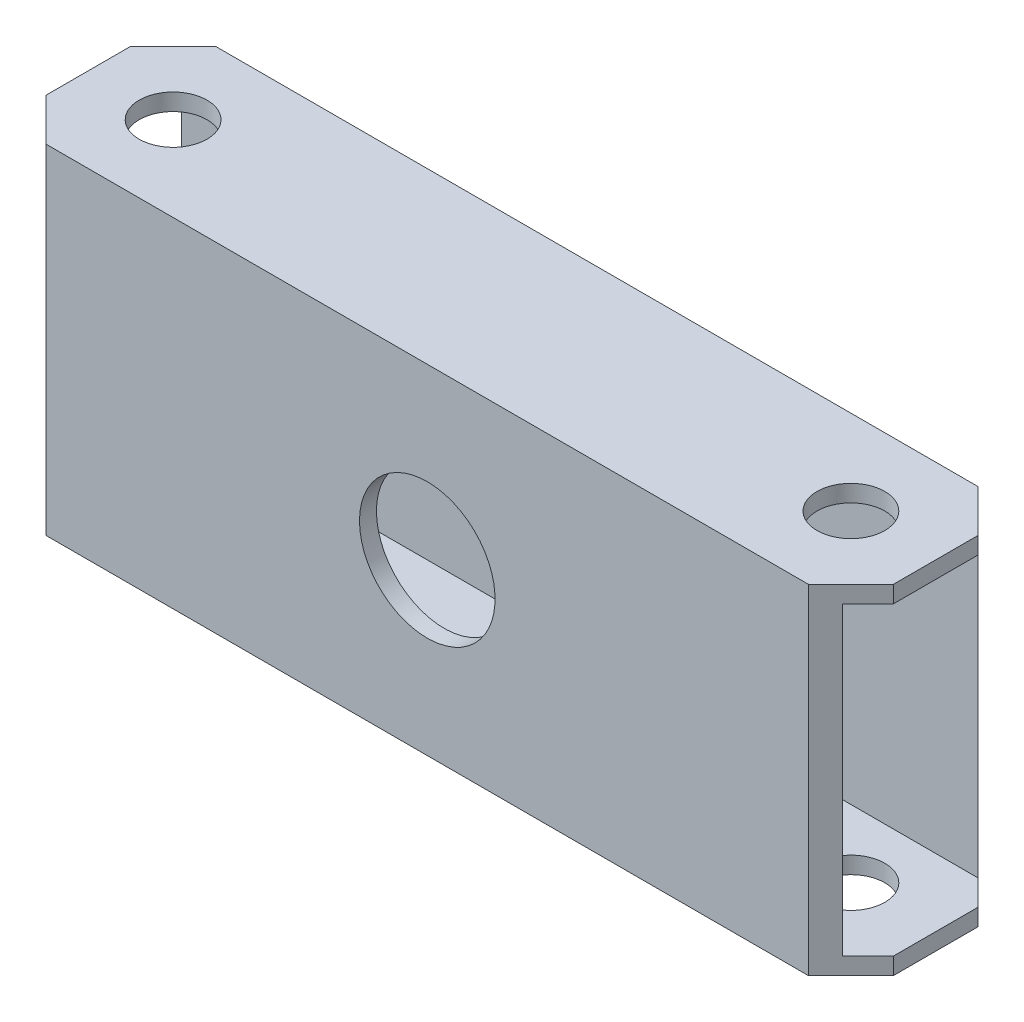
ISO-10303-21;
HEADER;
FILE_DESCRIPTION(('STEP AP214'),'2;1');
FILE_NAME('part.step','',(''),(''),'','','');
FILE_SCHEMA(('AUTOMOTIVE_DESIGN { 1 0 10303 214 1 1 1 1 }'));
ENDSEC;
DATA;
#1=APPLICATION_CONTEXT('core data for automotive mechanical design processes');
#2=APPLICATION_PROTOCOL_DEFINITION('international standard','automotive_design',2000,#1);
#3=PRODUCT_CONTEXT('',#1,'mechanical');
#4=PRODUCT('Part','Part','',(#3));
#5=PRODUCT_RELATED_PRODUCT_CATEGORY('part','',(#4));
#6=PRODUCT_DEFINITION_FORMATION('','',#4);
#7=PRODUCT_DEFINITION_CONTEXT('part definition',#1,'design');
#8=PRODUCT_DEFINITION('design','',#6,#7);
#9=PRODUCT_DEFINITION_SHAPE('','',#8);
#10=(LENGTH_UNIT() NAMED_UNIT(*) SI_UNIT(.MILLI.,.METRE.));
#11=(NAMED_UNIT(*) PLANE_ANGLE_UNIT() SI_UNIT($,.RADIAN.));
#12=(NAMED_UNIT(*) SI_UNIT($,.STERADIAN.) SOLID_ANGLE_UNIT());
#13=UNCERTAINTY_MEASURE_WITH_UNIT(LENGTH_MEASURE(1.E-05),#10,'distance_accuracy_value','');
#14=(GEOMETRIC_REPRESENTATION_CONTEXT(3) GLOBAL_UNCERTAINTY_ASSIGNED_CONTEXT((#13)) GLOBAL_UNIT_ASSIGNED_CONTEXT((#10,
#11,#12)) REPRESENTATION_CONTEXT('',''));
#15=CARTESIAN_POINT('',(0.,0.,0.));
#16=DIRECTION('',(0.,0.,1.));
#17=DIRECTION('',(1.,0.,0.));
#18=AXIS2_PLACEMENT_3D('',#15,#16,#17);
#19=CARTESIAN_POINT('',(0.,40.,0.));
#20=DIRECTION('',(1.,0.,0.));
#21=DIRECTION('',(0.,0.,-1.));
#22=AXIS2_PLACEMENT_3D('',#19,#20,#21);
#23=PLANE('',#22);
#24=DIRECTION('',(0.,0.,1.));
#25=VECTOR('',#24,1.);
#26=CARTESIAN_POINT('',(0.,40.,0.));
#27=LINE('',#26,#25);
#28=CARTESIAN_POINT('',(0.,40.,-14.9999999999999));
#29=VERTEX_POINT('',#28);
#30=CARTESIAN_POINT('',(0.,40.,-5.00000000000004));
#31=VERTEX_POINT('',#30);
#32=EDGE_CURVE('E309',#29,#31,#27,.T.);
#33=ORIENTED_EDGE('',*,*,#32,.F.);
#34=DIRECTION('',(0.,-1.,0.));
#35=VECTOR('',#34,1.);
#36=CARTESIAN_POINT('',(0.,40.,-14.9999999999999));
#37=LINE('',#36,#35);
#38=CARTESIAN_POINT('',(0.,38.,-14.9999999999999));
#39=VERTEX_POINT('',#38);
#40=EDGE_CURVE('E14',#29,#39,#37,.T.);
#41=ORIENTED_EDGE('',*,*,#40,.T.);
#42=DIRECTION('',(0.,0.,1.));
#43=VECTOR('',#42,1.);
#44=CARTESIAN_POINT('',(0.,38.,-18.));
#45=LINE('',#44,#43);
#46=CARTESIAN_POINT('',(0.,38.,-5.00000000000004));
#47=VERTEX_POINT('',#46);
#48=EDGE_CURVE('E369',#39,#47,#45,.T.);
#49=ORIENTED_EDGE('',*,*,#48,.T.);
#50=DIRECTION('',(0.,1.,0.));
#51=VECTOR('',#50,1.);
#52=CARTESIAN_POINT('',(0.,40.,-5.00000000000004));
#53=LINE('',#52,#51);
#54=EDGE_CURVE('E463',#47,#31,#53,.T.);
#55=ORIENTED_EDGE('',*,*,#54,.T.);
#56=EDGE_LOOP('',(#33,#41,#49,#55));
#57=FACE_BOUND('',#56,.T.);
#58=ADVANCED_FACE('F159',(#57),#23,.F.);
#59=CARTESIAN_POINT('',(100.,40.,0.));
#60=DIRECTION('',(-1.,0.,0.));
#61=DIRECTION('',(0.,0.,1.));
#62=AXIS2_PLACEMENT_3D('',#59,#60,#61);
#63=PLANE('',#62);
#64=DIRECTION('',(0.,0.,-1.));
#65=VECTOR('',#64,1.);
#66=CARTESIAN_POINT('',(100.,0.,0.));
#67=LINE('',#66,#65);
#68=CARTESIAN_POINT('',(100.,0.,-5.00000000000009));
#69=VERTEX_POINT('',#68);
#70=CARTESIAN_POINT('',(100.,0.,-15.));
#71=VERTEX_POINT('',#70);
#72=EDGE_CURVE('E310',#69,#71,#67,.T.);
#73=ORIENTED_EDGE('',*,*,#72,.T.);
#74=DIRECTION('',(0.,1.,0.));
#75=VECTOR('',#74,1.);
#76=CARTESIAN_POINT('',(100.,40.,-15.));
#77=LINE('',#76,#75);
#78=CARTESIAN_POINT('',(100.,2.,-15.));
#79=VERTEX_POINT('',#78);
#80=EDGE_CURVE('E282',#71,#79,#77,.T.);
#81=ORIENTED_EDGE('',*,*,#80,.T.);
#82=DIRECTION('',(0.,0.,-1.));
#83=VECTOR('',#82,1.);
#84=CARTESIAN_POINT('',(100.,2.,-2.));
#85=LINE('',#84,#83);
#86=CARTESIAN_POINT('',(100.,2.,-5.00000000000009));
#87=VERTEX_POINT('',#86);
#88=EDGE_CURVE('E347',#87,#79,#85,.T.);
#89=ORIENTED_EDGE('',*,*,#88,.F.);
#90=DIRECTION('',(0.,-1.,0.));
#91=VECTOR('',#90,1.);
#92=CARTESIAN_POINT('',(100.,40.,-5.00000000000009));
#93=LINE('',#92,#91);
#94=EDGE_CURVE('E288',#87,#69,#93,.T.);
#95=ORIENTED_EDGE('',*,*,#94,.T.);
#96=EDGE_LOOP('',(#73,#81,#89,#95));
#97=FACE_BOUND('',#96,.T.);
#98=ADVANCED_FACE('F516',(#97),#63,.F.);
#99=DIRECTION('',(0.,0.,-1.));
#100=VECTOR('',#99,1.);
#101=CARTESIAN_POINT('',(0.,2.,-2.));
#102=LINE('',#101,#100);
#103=CARTESIAN_POINT('',(0.,2.,-5.00000000000004));
#104=VERTEX_POINT('',#103);
#105=CARTESIAN_POINT('',(0.,2.,-14.9999999999999));
#106=VERTEX_POINT('',#105);
#107=EDGE_CURVE('E398',#104,#106,#102,.T.);
#108=ORIENTED_EDGE('',*,*,#107,.T.);
#109=DIRECTION('',(0.,-1.,0.));
#110=VECTOR('',#109,1.);
#111=CARTESIAN_POINT('',(0.,40.,-14.9999999999999));
#112=LINE('',#111,#110);
#113=CARTESIAN_POINT('',(0.,0.,-14.9999999999999));
#114=VERTEX_POINT('',#113);
#115=EDGE_CURVE('E169',#106,#114,#112,.T.);
#116=ORIENTED_EDGE('',*,*,#115,.T.);
#117=DIRECTION('',(0.,0.,1.));
#118=VECTOR('',#117,1.);
#119=CARTESIAN_POINT('',(0.,0.,0.));
#120=LINE('',#119,#118);
#121=CARTESIAN_POINT('',(0.,0.,-5.00000000000004));
#122=VERTEX_POINT('',#121);
#123=EDGE_CURVE('E474',#114,#122,#120,.T.);
#124=ORIENTED_EDGE('',*,*,#123,.T.);
#125=DIRECTION('',(0.,1.,0.));
#126=VECTOR('',#125,1.);
#127=CARTESIAN_POINT('',(0.,40.,-5.00000000000004));
#128=LINE('',#127,#126);
#129=EDGE_CURVE('E466',#122,#104,#128,.T.);
#130=ORIENTED_EDGE('',*,*,#129,.T.);
#131=EDGE_LOOP('',(#108,#116,#124,#130));
#132=FACE_BOUND('',#131,.T.);
#133=ADVANCED_FACE('F473',(#132),#23,.F.);
#134=DIRECTION('',(0.,0.,1.));
#135=VECTOR('',#134,1.);
#136=CARTESIAN_POINT('',(100.,38.,-18.));
#137=LINE('',#136,#135);
#138=CARTESIAN_POINT('',(100.,38.,-15.));
#139=VERTEX_POINT('',#138);
#140=CARTESIAN_POINT('',(100.,38.,-5.00000000000009));
#141=VERTEX_POINT('',#140);
#142=EDGE_CURVE('E325',#139,#141,#137,.T.);
#143=ORIENTED_EDGE('',*,*,#142,.F.);
#144=DIRECTION('',(0.,1.,0.));
#145=VECTOR('',#144,1.);
#146=CARTESIAN_POINT('',(100.,40.,-15.));
#147=LINE('',#146,#145);
#148=CARTESIAN_POINT('',(100.,40.,-15.));
#149=VERTEX_POINT('',#148);
#150=EDGE_CURVE('E428',#139,#149,#147,.T.);
#151=ORIENTED_EDGE('',*,*,#150,.T.);
#152=DIRECTION('',(0.,0.,-1.));
#153=VECTOR('',#152,1.);
#154=CARTESIAN_POINT('',(100.,40.,0.));
#155=LINE('',#154,#153);
#156=CARTESIAN_POINT('',(100.,40.,-5.00000000000009));
#157=VERTEX_POINT('',#156);
#158=EDGE_CURVE('E490',#157,#149,#155,.T.);
#159=ORIENTED_EDGE('',*,*,#158,.F.);
#160=DIRECTION('',(0.,-1.,0.));
#161=VECTOR('',#160,1.);
#162=CARTESIAN_POINT('',(100.,40.,-5.00000000000009));
#163=LINE('',#162,#161);
#164=EDGE_CURVE('E505',#157,#141,#163,.T.);
#165=ORIENTED_EDGE('',*,*,#164,.T.);
#166=EDGE_LOOP('',(#143,#151,#159,#165));
#167=FACE_BOUND('',#166,.T.);
#168=ADVANCED_FACE('F508',(#167),#63,.F.);
#169=CARTESIAN_POINT('',(90.,0.,-10.));
#170=DIRECTION('',(0.,1.,0.));
#171=DIRECTION('',(0.,0.,1.));
#172=AXIS2_PLACEMENT_3D('',#169,#170,#171);
#173=CYLINDRICAL_SURFACE('',#172,4.00000000000001);
#174=CARTESIAN_POINT('',(90.,0.,-10.));
#175=DIRECTION('',(0.,1.,0.));
#176=DIRECTION('',(0.,0.,1.));
#177=AXIS2_PLACEMENT_3D('',#174,#175,#176);
#178=CIRCLE('',#177,4.00000000000001);
#179=CARTESIAN_POINT('',(90.,0.,-6.));
#180=VERTEX_POINT('',#179);
#181=EDGE_CURVE('E550',#180,#180,#178,.F.);
#182=ORIENTED_EDGE('',*,*,#181,.T.);
#183=EDGE_LOOP('',(#182));
#184=FACE_BOUND('',#183,.T.);
#185=CARTESIAN_POINT('',(90.,2.,-10.));
#186=DIRECTION('',(0.,1.,0.));
#187=DIRECTION('',(0.,0.,1.));
#188=AXIS2_PLACEMENT_3D('',#185,#186,#187);
#189=CIRCLE('',#188,4.00000000000001);
#190=CARTESIAN_POINT('',(90.,2.,-6.));
#191=VERTEX_POINT('',#190);
#192=EDGE_CURVE('E338',#191,#191,#189,.T.);
#193=ORIENTED_EDGE('',*,*,#192,.T.);
#194=EDGE_LOOP('',(#193));
#195=FACE_BOUND('',#194,.T.);
#196=ADVANCED_FACE('F596',(#184,#195),#173,.F.);
#197=CARTESIAN_POINT('',(90.,40.,-10.));
#198=DIRECTION('',(0.,1.,0.));
#199=DIRECTION('',(0.,0.,1.));
#200=AXIS2_PLACEMENT_3D('',#197,#198,#199);
#201=CIRCLE('',#200,4.00000000000001);
#202=CARTESIAN_POINT('',(90.,40.,-6.));
#203=VERTEX_POINT('',#202);
#204=EDGE_CURVE('E546',#203,#203,#201,.F.);
#205=ORIENTED_EDGE('',*,*,#204,.F.);
#206=EDGE_LOOP('',(#205));
#207=FACE_BOUND('',#206,.T.);
#208=CARTESIAN_POINT('',(90.,38.,-10.));
#209=DIRECTION('',(0.,-1.,0.));
#210=DIRECTION('',(0.,0.,-1.));
#211=AXIS2_PLACEMENT_3D('',#208,#209,#210);
#212=CIRCLE('',#211,4.00000000000001);
#213=CARTESIAN_POINT('',(90.,38.,-14.));
#214=VERTEX_POINT('',#213);
#215=EDGE_CURVE('E333',#214,#214,#212,.T.);
#216=ORIENTED_EDGE('',*,*,#215,.T.);
#217=EDGE_LOOP('',(#216));
#218=FACE_BOUND('',#217,.T.);
#219=ADVANCED_FACE('F568',(#207,#218),#173,.F.);
#220=CARTESIAN_POINT('',(10.,0.,-10.));
#221=DIRECTION('',(0.,1.,0.));
#222=DIRECTION('',(0.,0.,1.));
#223=AXIS2_PLACEMENT_3D('',#220,#221,#222);
#224=CYLINDRICAL_SURFACE('',#223,4.);
#225=CARTESIAN_POINT('',(10.,0.,-10.));
#226=DIRECTION('',(0.,1.,0.));
#227=DIRECTION('',(0.,0.,1.));
#228=AXIS2_PLACEMENT_3D('',#225,#226,#227);
#229=CIRCLE('',#228,4.);
#230=CARTESIAN_POINT('',(10.,0.,-6.));
#231=VERTEX_POINT('',#230);
#232=EDGE_CURVE('E480',#231,#231,#229,.T.);
#233=ORIENTED_EDGE('',*,*,#232,.F.);
#234=EDGE_LOOP('',(#233));
#235=FACE_BOUND('',#234,.T.);
#236=CARTESIAN_POINT('',(10.,2.,-10.));
#237=DIRECTION('',(0.,1.,0.));
#238=DIRECTION('',(0.,0.,1.));
#239=AXIS2_PLACEMENT_3D('',#236,#237,#238);
#240=CIRCLE('',#239,4.);
#241=CARTESIAN_POINT('',(10.,2.,-6.));
#242=VERTEX_POINT('',#241);
#243=EDGE_CURVE('E334',#242,#242,#240,.F.);
#244=ORIENTED_EDGE('',*,*,#243,.F.);
#245=EDGE_LOOP('',(#244));
#246=FACE_BOUND('',#245,.T.);
#247=ADVANCED_FACE('F564',(#235,#246),#224,.F.);
#248=CARTESIAN_POINT('',(10.,40.,-10.));
#249=DIRECTION('',(0.,1.,0.));
#250=DIRECTION('',(0.,0.,1.));
#251=AXIS2_PLACEMENT_3D('',#248,#249,#250);
#252=CIRCLE('',#251,4.);
#253=CARTESIAN_POINT('',(10.,40.,-6.));
#254=VERTEX_POINT('',#253);
#255=EDGE_CURVE('E554',#254,#254,#252,.T.);
#256=ORIENTED_EDGE('',*,*,#255,.T.);
#257=EDGE_LOOP('',(#256));
#258=FACE_BOUND('',#257,.T.);
#259=CARTESIAN_POINT('',(10.,38.,-10.));
#260=DIRECTION('',(0.,-1.,0.));
#261=DIRECTION('',(0.,0.,-1.));
#262=AXIS2_PLACEMENT_3D('',#259,#260,#261);
#263=CIRCLE('',#262,4.);
#264=CARTESIAN_POINT('',(10.,38.,-14.));
#265=VERTEX_POINT('',#264);
#266=EDGE_CURVE('E329',#265,#265,#263,.F.);
#267=ORIENTED_EDGE('',*,*,#266,.F.);
#268=EDGE_LOOP('',(#267));
#269=FACE_BOUND('',#268,.T.);
#270=ADVANCED_FACE('F567',(#258,#269),#224,.F.);
#271=CARTESIAN_POINT('',(50.,20.,0.));
#272=DIRECTION('',(0.,0.,-1.));
#273=DIRECTION('',(-1.,0.,0.));
#274=AXIS2_PLACEMENT_3D('',#271,#272,#273);
#275=CYLINDRICAL_SURFACE('',#274,8.);
#276=CARTESIAN_POINT('',(50.,20.,0.));
#277=DIRECTION('',(0.,0.,-1.));
#278=DIRECTION('',(-1.,0.,0.));
#279=AXIS2_PLACEMENT_3D('',#276,#277,#278);
#280=CIRCLE('',#279,8.);
#281=CARTESIAN_POINT('',(42.,20.,0.));
#282=VERTEX_POINT('',#281);
#283=EDGE_CURVE('E542',#282,#282,#280,.T.);
#284=ORIENTED_EDGE('',*,*,#283,.F.);
#285=EDGE_LOOP('',(#284));
#286=FACE_BOUND('',#285,.T.);
#287=CARTESIAN_POINT('',(50.,20.,-2.));
#288=DIRECTION('',(0.,0.,-1.));
#289=DIRECTION('',(0.,1.,0.));
#290=AXIS2_PLACEMENT_3D('',#287,#288,#289);
#291=CIRCLE('',#290,8.);
#292=CARTESIAN_POINT('',(50.,28.,-2.));
#293=VERTEX_POINT('',#292);
#294=EDGE_CURVE('E324',#293,#293,#291,.F.);
#295=ORIENTED_EDGE('',*,*,#294,.F.);
#296=EDGE_LOOP('',(#295));
#297=FACE_BOUND('',#296,.T.);
#298=ADVANCED_FACE('F643',(#286,#297),#275,.F.);
#299=CARTESIAN_POINT('',(50.,20.,-20.));
#300=DIRECTION('',(0.,0.,-1.));
#301=DIRECTION('',(-1.,0.,0.));
#302=AXIS2_PLACEMENT_3D('',#299,#300,#301);
#303=CIRCLE('',#302,8.);
#304=CARTESIAN_POINT('',(42.,20.,-20.));
#305=VERTEX_POINT('',#304);
#306=EDGE_CURVE('E539',#305,#305,#303,.T.);
#307=ORIENTED_EDGE('',*,*,#306,.T.);
#308=EDGE_LOOP('',(#307));
#309=FACE_BOUND('',#308,.T.);
#310=CARTESIAN_POINT('',(50.,20.,-18.));
#311=DIRECTION('',(0.,0.,1.));
#312=DIRECTION('',(0.,-1.,0.));
#313=AXIS2_PLACEMENT_3D('',#310,#311,#312);
#314=CIRCLE('',#313,8.);
#315=CARTESIAN_POINT('',(50.,12.,-18.));
#316=VERTEX_POINT('',#315);
#317=EDGE_CURVE('E320',#316,#316,#314,.F.);
#318=ORIENTED_EDGE('',*,*,#317,.F.);
#319=EDGE_LOOP('',(#318));
#320=FACE_BOUND('',#319,.T.);
#321=ADVANCED_FACE('F646',(#309,#320),#275,.F.);
#322=CARTESIAN_POINT('',(0.,40.,0.));
#323=DIRECTION('',(0.,-1.,0.));
#324=DIRECTION('',(0.,0.,-1.));
#325=AXIS2_PLACEMENT_3D('',#322,#323,#324);
#326=PLANE('',#325);
#327=ORIENTED_EDGE('',*,*,#158,.T.);
#328=DIRECTION('',(0.707106781186551,0.,0.707106781186544));
#329=VECTOR('',#328,1.);
#330=CARTESIAN_POINT('',(94.9999999999999,40.,-20.));
#331=LINE('',#330,#329);
#332=CARTESIAN_POINT('',(94.9999999999999,40.,-20.));
#333=VERTEX_POINT('',#332);
#334=EDGE_CURVE('E448',#149,#333,#331,.F.);
#335=ORIENTED_EDGE('',*,*,#334,.T.);
#336=DIRECTION('',(-1.,0.,0.));
#337=VECTOR('',#336,1.);
#338=CARTESIAN_POINT('',(0.,40.,-20.));
#339=LINE('',#338,#337);
#340=CARTESIAN_POINT('',(5.00000000000004,40.,-20.));
#341=VERTEX_POINT('',#340);
#342=EDGE_CURVE('E298',#333,#341,#339,.T.);
#343=ORIENTED_EDGE('',*,*,#342,.T.);
#344=DIRECTION('',(0.707106781186544,0.,-0.707106781186551));
#345=VECTOR('',#344,1.);
#346=CARTESIAN_POINT('',(0.,40.,-14.9999999999999));
#347=LINE('',#346,#345);
#348=EDGE_CURVE('E437',#341,#29,#347,.F.);
#349=ORIENTED_EDGE('',*,*,#348,.T.);
#350=ORIENTED_EDGE('',*,*,#32,.T.);
#351=DIRECTION('',(-0.707106781186551,0.,-0.707106781186544));
#352=VECTOR('',#351,1.);
#353=CARTESIAN_POINT('',(5.00000000000009,40.,0.));
#354=LINE('',#353,#352);
#355=CARTESIAN_POINT('',(5.00000000000009,40.,0.));
#356=VERTEX_POINT('',#355);
#357=EDGE_CURVE('E183',#31,#356,#354,.F.);
#358=ORIENTED_EDGE('',*,*,#357,.T.);
#359=DIRECTION('',(1.,0.,0.));
#360=VECTOR('',#359,1.);
#361=CARTESIAN_POINT('',(0.,40.,0.));
#362=LINE('',#361,#360);
#363=CARTESIAN_POINT('',(95.,40.,0.));
#364=VERTEX_POINT('',#363);
#365=EDGE_CURVE('E314',#356,#364,#362,.T.);
#366=ORIENTED_EDGE('',*,*,#365,.T.);
#367=DIRECTION('',(-0.707106781186544,0.,0.707106781186551));
#368=VECTOR('',#367,1.);
#369=CARTESIAN_POINT('',(100.,40.,-5.00000000000009));
#370=LINE('',#369,#368);
#371=EDGE_CURVE('E445',#364,#157,#370,.F.);
#372=ORIENTED_EDGE('',*,*,#371,.T.);
#373=EDGE_LOOP('',(#327,#335,#343,#349,#350,#358,#366,#372));
#374=FACE_BOUND('',#373,.T.);
#375=ORIENTED_EDGE('',*,*,#204,.T.);
#376=EDGE_LOOP('',(#375));
#377=FACE_BOUND('',#376,.T.);
#378=ORIENTED_EDGE('',*,*,#255,.F.);
#379=EDGE_LOOP('',(#378));
#380=FACE_BOUND('',#379,.T.);
#381=ADVANCED_FACE('F486',(#374,#377,#380),#326,.F.);
#382=CARTESIAN_POINT('',(0.,0.,0.));
#383=DIRECTION('',(0.,-1.,0.));
#384=DIRECTION('',(0.,0.,-1.));
#385=AXIS2_PLACEMENT_3D('',#382,#383,#384);
#386=PLANE('',#385);
#387=ORIENTED_EDGE('',*,*,#181,.F.);
#388=EDGE_LOOP('',(#387));
#389=FACE_BOUND('',#388,.T.);
#390=DIRECTION('',(-1.,0.,0.));
#391=VECTOR('',#390,1.);
#392=CARTESIAN_POINT('',(0.,0.,-20.));
#393=LINE('',#392,#391);
#394=CARTESIAN_POINT('',(94.9999999999999,0.,-20.));
#395=VERTEX_POINT('',#394);
#396=CARTESIAN_POINT('',(5.00000000000004,0.,-20.));
#397=VERTEX_POINT('',#396);
#398=EDGE_CURVE('E295',#395,#397,#393,.T.);
#399=ORIENTED_EDGE('',*,*,#398,.F.);
#400=DIRECTION('',(-0.707106781186551,0.,-0.707106781186544));
#401=VECTOR('',#400,1.);
#402=CARTESIAN_POINT('',(57.4999999999995,0.,-57.5000000000001));
#403=LINE('',#402,#401);
#404=EDGE_CURVE('E276',#395,#71,#403,.F.);
#405=ORIENTED_EDGE('',*,*,#404,.T.);
#406=ORIENTED_EDGE('',*,*,#72,.F.);
#407=DIRECTION('',(0.707106781186544,0.,-0.707106781186551));
#408=VECTOR('',#407,1.);
#409=CARTESIAN_POINT('',(47.5000000000005,0.,47.5));
#410=LINE('',#409,#408);
#411=CARTESIAN_POINT('',(95.,0.,0.));
#412=VERTEX_POINT('',#411);
#413=EDGE_CURVE('E289',#69,#412,#410,.F.);
#414=ORIENTED_EDGE('',*,*,#413,.T.);
#415=DIRECTION('',(1.,0.,0.));
#416=VECTOR('',#415,1.);
#417=CARTESIAN_POINT('',(0.,0.,0.));
#418=LINE('',#417,#416);
#419=CARTESIAN_POINT('',(5.00000000000009,0.,0.));
#420=VERTEX_POINT('',#419);
#421=EDGE_CURVE('E316',#420,#412,#418,.T.);
#422=ORIENTED_EDGE('',*,*,#421,.F.);
#423=DIRECTION('',(0.707106781186551,0.,0.707106781186544));
#424=VECTOR('',#423,1.);
#425=CARTESIAN_POINT('',(2.50000000000002,0.,-2.50000000000004));
#426=LINE('',#425,#424);
#427=EDGE_CURVE('E300',#420,#122,#426,.F.);
#428=ORIENTED_EDGE('',*,*,#427,.T.);
#429=ORIENTED_EDGE('',*,*,#123,.F.);
#430=DIRECTION('',(-0.707106781186544,0.,0.707106781186551));
#431=VECTOR('',#430,1.);
#432=CARTESIAN_POINT('',(-7.49999999999996,0.,-7.49999999999988));
#433=LINE('',#432,#431);
#434=EDGE_CURVE('E307',#114,#397,#433,.F.);
#435=ORIENTED_EDGE('',*,*,#434,.T.);
#436=EDGE_LOOP('',(#399,#405,#406,#414,#422,#428,#429,#435));
#437=FACE_BOUND('',#436,.T.);
#438=ORIENTED_EDGE('',*,*,#232,.T.);
#439=EDGE_LOOP('',(#438));
#440=FACE_BOUND('',#439,.T.);
#441=ADVANCED_FACE('F303',(#389,#437,#440),#386,.T.);
#442=CARTESIAN_POINT('',(0.,40.,0.));
#443=DIRECTION('',(0.,0.,-1.));
#444=DIRECTION('',(-1.,0.,0.));
#445=AXIS2_PLACEMENT_3D('',#442,#443,#444);
#446=PLANE('',#445);
#447=ORIENTED_EDGE('',*,*,#283,.T.);
#448=EDGE_LOOP('',(#447));
#449=FACE_BOUND('',#448,.T.);
#450=ORIENTED_EDGE('',*,*,#421,.T.);
#451=DIRECTION('',(0.,1.,0.));
#452=VECTOR('',#451,1.);
#453=CARTESIAN_POINT('',(95.,40.,0.));
#454=LINE('',#453,#452);
#455=EDGE_CURVE('E176',#412,#364,#454,.T.);
#456=ORIENTED_EDGE('',*,*,#455,.T.);
#457=ORIENTED_EDGE('',*,*,#365,.F.);
#458=DIRECTION('',(0.,-1.,0.));
#459=VECTOR('',#458,1.);
#460=CARTESIAN_POINT('',(5.00000000000009,40.,0.));
#461=LINE('',#460,#459);
#462=EDGE_CURVE('E457',#356,#420,#461,.T.);
#463=ORIENTED_EDGE('',*,*,#462,.T.);
#464=EDGE_LOOP('',(#450,#456,#457,#463));
#465=FACE_BOUND('',#464,.T.);
#466=ADVANCED_FACE('F496',(#449,#465),#446,.F.);
#467=CARTESIAN_POINT('',(0.,40.,-20.));
#468=DIRECTION('',(0.,0.,1.));
#469=DIRECTION('',(1.,0.,0.));
#470=AXIS2_PLACEMENT_3D('',#467,#468,#469);
#471=PLANE('',#470);
#472=ORIENTED_EDGE('',*,*,#306,.F.);
#473=EDGE_LOOP('',(#472));
#474=FACE_BOUND('',#473,.T.);
#475=ORIENTED_EDGE('',*,*,#342,.F.);
#476=DIRECTION('',(0.,-1.,0.));
#477=VECTOR('',#476,1.);
#478=CARTESIAN_POINT('',(94.9999999999999,40.,-20.));
#479=LINE('',#478,#477);
#480=EDGE_CURVE('E281',#333,#395,#479,.T.);
#481=ORIENTED_EDGE('',*,*,#480,.T.);
#482=ORIENTED_EDGE('',*,*,#398,.T.);
#483=DIRECTION('',(0.,1.,0.));
#484=VECTOR('',#483,1.);
#485=CARTESIAN_POINT('',(5.00000000000004,40.,-20.));
#486=LINE('',#485,#484);
#487=EDGE_CURVE('E301',#397,#341,#486,.T.);
#488=ORIENTED_EDGE('',*,*,#487,.T.);
#489=EDGE_LOOP('',(#475,#481,#482,#488));
#490=FACE_BOUND('',#489,.T.);
#491=ADVANCED_FACE('F294',(#474,#490),#471,.F.);
#492=CARTESIAN_POINT('',(100.,2.,-2.));
#493=DIRECTION('',(0.,1.,0.));
#494=DIRECTION('',(0.,0.,1.));
#495=AXIS2_PLACEMENT_3D('',#492,#493,#494);
#496=PLANE('',#495);
#497=ORIENTED_EDGE('',*,*,#192,.F.);
#498=EDGE_LOOP('',(#497));
#499=FACE_BOUND('',#498,.T.);
#500=ORIENTED_EDGE('',*,*,#88,.T.);
#501=DIRECTION('',(0.707106781186551,0.,0.707106781186544));
#502=VECTOR('',#501,1.);
#503=CARTESIAN_POINT('',(106.5,2.,-8.50000000000005));
#504=LINE('',#503,#502);
#505=CARTESIAN_POINT('',(96.9999999999999,2.,-18.));
#506=VERTEX_POINT('',#505);
#507=EDGE_CURVE('E370',#79,#506,#504,.F.);
#508=ORIENTED_EDGE('',*,*,#507,.T.);
#509=DIRECTION('',(-1.,0.,0.));
#510=VECTOR('',#509,1.);
#511=CARTESIAN_POINT('',(100.,2.,-18.));
#512=LINE('',#511,#510);
#513=CARTESIAN_POINT('',(3.00000000000006,2.,-18.));
#514=VERTEX_POINT('',#513);
#515=EDGE_CURVE('E352',#506,#514,#512,.T.);
#516=ORIENTED_EDGE('',*,*,#515,.T.);
#517=DIRECTION('',(0.707106781186544,0.,-0.707106781186551));
#518=VECTOR('',#517,1.);
#519=CARTESIAN_POINT('',(43.4999999999995,2.,-58.4999999999999));
#520=LINE('',#519,#518);
#521=EDGE_CURVE('E406',#514,#106,#520,.F.);
#522=ORIENTED_EDGE('',*,*,#521,.T.);
#523=ORIENTED_EDGE('',*,*,#107,.F.);
#524=DIRECTION('',(-0.707106781186551,0.,-0.707106781186544));
#525=VECTOR('',#524,1.);
#526=CARTESIAN_POINT('',(51.5000000000005,2.,46.5));
#527=LINE('',#526,#525);
#528=CARTESIAN_POINT('',(3.00000000000007,2.,-2.));
#529=VERTEX_POINT('',#528);
#530=EDGE_CURVE('E403',#104,#529,#527,.F.);
#531=ORIENTED_EDGE('',*,*,#530,.T.);
#532=DIRECTION('',(-1.,0.,0.));
#533=VECTOR('',#532,1.);
#534=CARTESIAN_POINT('',(100.,2.,-2.));
#535=LINE('',#534,#533);
#536=CARTESIAN_POINT('',(96.9999999999999,2.,-2.));
#537=VERTEX_POINT('',#536);
#538=EDGE_CURVE('E353',#537,#529,#535,.T.);
#539=ORIENTED_EDGE('',*,*,#538,.F.);
#540=DIRECTION('',(-0.707106781186544,0.,0.707106781186551));
#541=VECTOR('',#540,1.);
#542=CARTESIAN_POINT('',(98.5,2.,-3.50000000000003));
#543=LINE('',#542,#541);
#544=EDGE_CURVE('E408',#537,#87,#543,.F.);
#545=ORIENTED_EDGE('',*,*,#544,.T.);
#546=EDGE_LOOP('',(#500,#508,#516,#522,#523,#531,#539,#545));
#547=FACE_BOUND('',#546,.T.);
#548=ORIENTED_EDGE('',*,*,#243,.T.);
#549=EDGE_LOOP('',(#548));
#550=FACE_BOUND('',#549,.T.);
#551=ADVANCED_FACE('F416',(#499,#547,#550),#496,.T.);
#552=CARTESIAN_POINT('',(100.,38.,-18.));
#553=DIRECTION('',(0.,-1.,0.));
#554=DIRECTION('',(0.,0.,-1.));
#555=AXIS2_PLACEMENT_3D('',#552,#553,#554);
#556=PLANE('',#555);
#557=ORIENTED_EDGE('',*,*,#215,.F.);
#558=EDGE_LOOP('',(#557));
#559=FACE_BOUND('',#558,.T.);
#560=DIRECTION('',(-1.,0.,0.));
#561=VECTOR('',#560,1.);
#562=CARTESIAN_POINT('',(100.,38.,-18.));
#563=LINE('',#562,#561);
#564=CARTESIAN_POINT('',(96.9999999999999,38.,-18.));
#565=VERTEX_POINT('',#564);
#566=CARTESIAN_POINT('',(3.00000000000007,38.,-18.));
#567=VERTEX_POINT('',#566);
#568=EDGE_CURVE('E364',#565,#567,#563,.T.);
#569=ORIENTED_EDGE('',*,*,#568,.F.);
#570=DIRECTION('',(-0.707106781186551,0.,-0.707106781186544));
#571=VECTOR('',#570,1.);
#572=CARTESIAN_POINT('',(98.5,38.,-16.5));
#573=LINE('',#572,#571);
#574=EDGE_CURVE('E427',#565,#139,#573,.F.);
#575=ORIENTED_EDGE('',*,*,#574,.T.);
#576=ORIENTED_EDGE('',*,*,#142,.T.);
#577=DIRECTION('',(0.707106781186544,0.,-0.707106781186551));
#578=VECTOR('',#577,1.);
#579=CARTESIAN_POINT('',(106.5,38.,-11.5000000000001));
#580=LINE('',#579,#578);
#581=CARTESIAN_POINT('',(96.9999999999999,38.,-2.));
#582=VERTEX_POINT('',#581);
#583=EDGE_CURVE('E433',#141,#582,#580,.F.);
#584=ORIENTED_EDGE('',*,*,#583,.T.);
#585=DIRECTION('',(-1.,0.,0.));
#586=VECTOR('',#585,1.);
#587=CARTESIAN_POINT('',(100.,38.,-2.));
#588=LINE('',#587,#586);
#589=CARTESIAN_POINT('',(3.00000000000007,38.,-2.));
#590=VERTEX_POINT('',#589);
#591=EDGE_CURVE('E383',#582,#590,#588,.T.);
#592=ORIENTED_EDGE('',*,*,#591,.T.);
#593=DIRECTION('',(0.707106781186551,0.,0.707106781186544));
#594=VECTOR('',#593,1.);
#595=CARTESIAN_POINT('',(43.5000000000005,38.,38.5));
#596=LINE('',#595,#594);
#597=EDGE_CURVE('E378',#590,#47,#596,.F.);
#598=ORIENTED_EDGE('',*,*,#597,.T.);
#599=ORIENTED_EDGE('',*,*,#48,.F.);
#600=DIRECTION('',(-0.707106781186544,0.,0.707106781186551));
#601=VECTOR('',#600,1.);
#602=CARTESIAN_POINT('',(51.4999999999995,38.,-66.5));
#603=LINE('',#602,#601);
#604=EDGE_CURVE('E439',#39,#567,#603,.F.);
#605=ORIENTED_EDGE('',*,*,#604,.T.);
#606=EDGE_LOOP('',(#569,#575,#576,#584,#592,#598,#599,#605));
#607=FACE_BOUND('',#606,.T.);
#608=ORIENTED_EDGE('',*,*,#266,.T.);
#609=EDGE_LOOP('',(#608));
#610=FACE_BOUND('',#609,.T.);
#611=ADVANCED_FACE('F528',(#559,#607,#610),#556,.T.);
#612=CARTESIAN_POINT('',(100.,38.,-2.));
#613=DIRECTION('',(0.,0.,-1.));
#614=DIRECTION('',(0.,1.,0.));
#615=AXIS2_PLACEMENT_3D('',#612,#613,#614);
#616=PLANE('',#615);
#617=ORIENTED_EDGE('',*,*,#591,.F.);
#618=DIRECTION('',(0.,1.,0.));
#619=VECTOR('',#618,1.);
#620=CARTESIAN_POINT('',(96.9999999999999,38.,-2.));
#621=LINE('',#620,#619);
#622=EDGE_CURVE('E454',#582,#537,#621,.F.);
#623=ORIENTED_EDGE('',*,*,#622,.T.);
#624=ORIENTED_EDGE('',*,*,#538,.T.);
#625=DIRECTION('',(0.,-1.,0.));
#626=VECTOR('',#625,1.);
#627=CARTESIAN_POINT('',(3.00000000000007,38.,-2.));
#628=LINE('',#627,#626);
#629=EDGE_CURVE('E451',#529,#590,#628,.F.);
#630=ORIENTED_EDGE('',*,*,#629,.T.);
#631=EDGE_LOOP('',(#617,#623,#624,#630));
#632=FACE_BOUND('',#631,.T.);
#633=ORIENTED_EDGE('',*,*,#294,.T.);
#634=EDGE_LOOP('',(#633));
#635=FACE_BOUND('',#634,.T.);
#636=ADVANCED_FACE('F520',(#632,#635),#616,.T.);
#637=CARTESIAN_POINT('',(100.,2.,-18.));
#638=DIRECTION('',(0.,0.,1.));
#639=DIRECTION('',(0.,-1.,0.));
#640=AXIS2_PLACEMENT_3D('',#637,#638,#639);
#641=PLANE('',#640);
#642=ORIENTED_EDGE('',*,*,#515,.F.);
#643=DIRECTION('',(0.,-1.,0.));
#644=VECTOR('',#643,1.);
#645=CARTESIAN_POINT('',(96.9999999999999,2.,-18.));
#646=LINE('',#645,#644);
#647=EDGE_CURVE('E375',#506,#565,#646,.F.);
#648=ORIENTED_EDGE('',*,*,#647,.T.);
#649=ORIENTED_EDGE('',*,*,#568,.T.);
#650=DIRECTION('',(0.,1.,0.));
#651=VECTOR('',#650,1.);
#652=CARTESIAN_POINT('',(3.00000000000006,2.00000000000002,-18.));
#653=LINE('',#652,#651);
#654=EDGE_CURVE('E372',#567,#514,#653,.F.);
#655=ORIENTED_EDGE('',*,*,#654,.T.);
#656=EDGE_LOOP('',(#642,#648,#649,#655));
#657=FACE_BOUND('',#656,.T.);
#658=ORIENTED_EDGE('',*,*,#317,.T.);
#659=EDGE_LOOP('',(#658));
#660=FACE_BOUND('',#659,.T.);
#661=ADVANCED_FACE('F421',(#657,#660),#641,.T.);
#662=CARTESIAN_POINT('',(94.9999999999999,40.,-20.));
#663=DIRECTION('',(-0.707106781186544,0.,0.707106781186551));
#664=DIRECTION('',(0.,-1.,0.));
#665=AXIS2_PLACEMENT_3D('',#662,#663,#664);
#666=PLANE('',#665);
#667=ORIENTED_EDGE('',*,*,#507,.F.);
#668=ORIENTED_EDGE('',*,*,#80,.F.);
#669=ORIENTED_EDGE('',*,*,#404,.F.);
#670=ORIENTED_EDGE('',*,*,#480,.F.);
#671=ORIENTED_EDGE('',*,*,#334,.F.);
#672=ORIENTED_EDGE('',*,*,#150,.F.);
#673=ORIENTED_EDGE('',*,*,#574,.F.);
#674=ORIENTED_EDGE('',*,*,#647,.F.);
#675=EDGE_LOOP('',(#667,#668,#669,#670,#671,#672,#673,#674));
#676=FACE_BOUND('',#675,.T.);
#677=ADVANCED_FACE('F279',(#676),#666,.F.);
#678=CARTESIAN_POINT('',(100.,40.,-5.00000000000009));
#679=DIRECTION('',(-0.707106781186551,0.,-0.707106781186544));
#680=DIRECTION('',(0.,-1.,0.));
#681=AXIS2_PLACEMENT_3D('',#678,#679,#680);
#682=PLANE('',#681);
#683=ORIENTED_EDGE('',*,*,#371,.F.);
#684=ORIENTED_EDGE('',*,*,#455,.F.);
#685=ORIENTED_EDGE('',*,*,#413,.F.);
#686=ORIENTED_EDGE('',*,*,#94,.F.);
#687=ORIENTED_EDGE('',*,*,#544,.F.);
#688=ORIENTED_EDGE('',*,*,#622,.F.);
#689=ORIENTED_EDGE('',*,*,#583,.F.);
#690=ORIENTED_EDGE('',*,*,#164,.F.);
#691=EDGE_LOOP('',(#683,#684,#685,#686,#687,#688,#689,#690));
#692=FACE_BOUND('',#691,.T.);
#693=ADVANCED_FACE('F501',(#692),#682,.F.);
#694=CARTESIAN_POINT('',(0.,40.,-14.9999999999999));
#695=DIRECTION('',(0.707106781186551,0.,0.707106781186544));
#696=DIRECTION('',(0.,-1.,0.));
#697=AXIS2_PLACEMENT_3D('',#694,#695,#696);
#698=PLANE('',#697);
#699=ORIENTED_EDGE('',*,*,#348,.F.);
#700=ORIENTED_EDGE('',*,*,#487,.F.);
#701=ORIENTED_EDGE('',*,*,#434,.F.);
#702=ORIENTED_EDGE('',*,*,#115,.F.);
#703=ORIENTED_EDGE('',*,*,#521,.F.);
#704=ORIENTED_EDGE('',*,*,#654,.F.);
#705=ORIENTED_EDGE('',*,*,#604,.F.);
#706=ORIENTED_EDGE('',*,*,#40,.F.);
#707=EDGE_LOOP('',(#699,#700,#701,#702,#703,#704,#705,#706));
#708=FACE_BOUND('',#707,.T.);
#709=ADVANCED_FACE('F483',(#708),#698,.F.);
#710=CARTESIAN_POINT('',(5.00000000000009,40.,0.));
#711=DIRECTION('',(0.707106781186544,0.,-0.707106781186551));
#712=DIRECTION('',(0.,-1.,0.));
#713=AXIS2_PLACEMENT_3D('',#710,#711,#712);
#714=PLANE('',#713);
#715=ORIENTED_EDGE('',*,*,#530,.F.);
#716=ORIENTED_EDGE('',*,*,#129,.F.);
#717=ORIENTED_EDGE('',*,*,#427,.F.);
#718=ORIENTED_EDGE('',*,*,#462,.F.);
#719=ORIENTED_EDGE('',*,*,#357,.F.);
#720=ORIENTED_EDGE('',*,*,#54,.F.);
#721=ORIENTED_EDGE('',*,*,#597,.F.);
#722=ORIENTED_EDGE('',*,*,#629,.F.);
#723=EDGE_LOOP('',(#715,#716,#717,#718,#719,#720,#721,#722));
#724=FACE_BOUND('',#723,.T.);
#725=ADVANCED_FACE('F162',(#724),#714,.F.);
#726=CLOSED_SHELL('',(#58,#98,#133,#168,#196,#219,#247,#270,#298,#321,#381,#441,#466,#491,#551,
#611,#636,#661,#677,#693,#709,#725));
#727=MANIFOLD_SOLID_BREP('B2',#726);
#728=ADVANCED_BREP_SHAPE_REPRESENTATION('',(#18,#727),#14);
#729=SHAPE_DEFINITION_REPRESENTATION(#9,#728);
ENDSEC;
END-ISO-10303-21;
